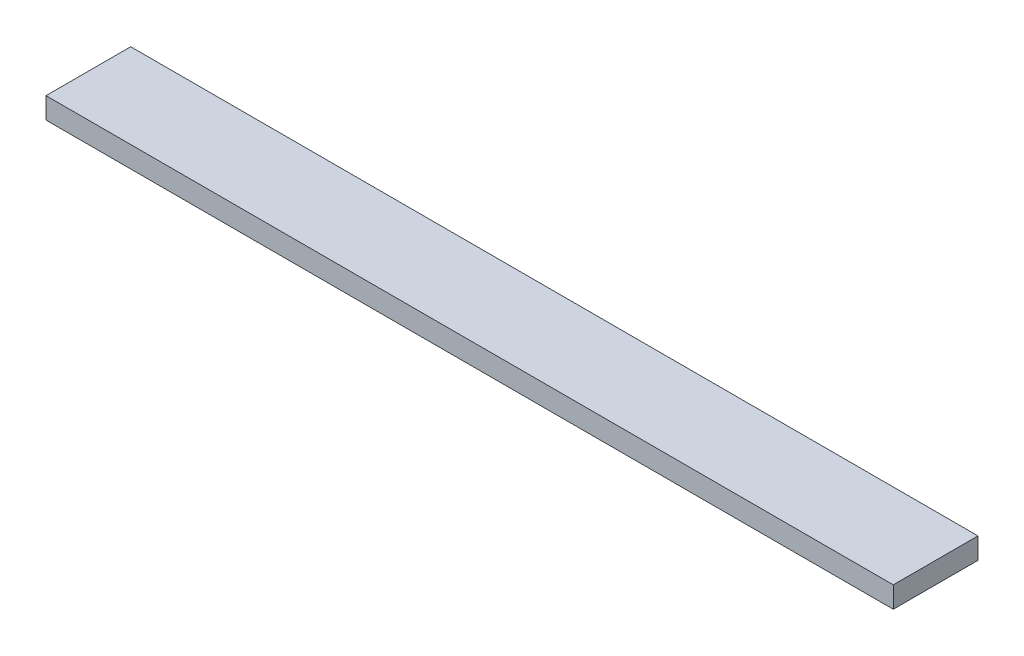
ISO-10303-21;
HEADER;
FILE_DESCRIPTION(('STEP AP214'),'2;1');
FILE_NAME('part.step','',(''),(''),'','','');
FILE_SCHEMA(('AUTOMOTIVE_DESIGN { 1 0 10303 214 1 1 1 1 }'));
ENDSEC;
DATA;
#1=APPLICATION_CONTEXT('core data for automotive mechanical design processes');
#2=APPLICATION_PROTOCOL_DEFINITION('international standard','automotive_design',2000,#1);
#3=PRODUCT_CONTEXT('',#1,'mechanical');
#4=PRODUCT('Part','Part','',(#3));
#5=PRODUCT_RELATED_PRODUCT_CATEGORY('part','',(#4));
#6=PRODUCT_DEFINITION_FORMATION('','',#4);
#7=PRODUCT_DEFINITION_CONTEXT('part definition',#1,'design');
#8=PRODUCT_DEFINITION('design','',#6,#7);
#9=PRODUCT_DEFINITION_SHAPE('','',#8);
#10=(LENGTH_UNIT() NAMED_UNIT(*) SI_UNIT(.MILLI.,.METRE.));
#11=(NAMED_UNIT(*) PLANE_ANGLE_UNIT() SI_UNIT($,.RADIAN.));
#12=(NAMED_UNIT(*) SI_UNIT($,.STERADIAN.) SOLID_ANGLE_UNIT());
#13=UNCERTAINTY_MEASURE_WITH_UNIT(LENGTH_MEASURE(1.E-05),#10,'distance_accuracy_value','');
#14=(GEOMETRIC_REPRESENTATION_CONTEXT(3) GLOBAL_UNCERTAINTY_ASSIGNED_CONTEXT((#13)) GLOBAL_UNIT_ASSIGNED_CONTEXT((#10,
#11,#12)) REPRESENTATION_CONTEXT('',''));
#15=CARTESIAN_POINT('',(0.,0.,0.));
#16=DIRECTION('',(0.,0.,1.));
#17=DIRECTION('',(1.,0.,0.));
#18=AXIS2_PLACEMENT_3D('',#15,#16,#17);
#19=CARTESIAN_POINT('',(-199.999999999999,-199.999999999999,40.));
#20=DIRECTION('',(1.,0.,0.));
#21=DIRECTION('',(0.,1.,0.));
#22=AXIS2_PLACEMENT_3D('',#19,#20,#21);
#23=PLANE('',#22);
#24=DIRECTION('',(0.,-1.,0.));
#25=VECTOR('',#24,1.);
#26=CARTESIAN_POINT('',(-199.999999999999,-199.999999999999,0.));
#27=LINE('',#26,#25);
#28=CARTESIAN_POINT('',(-199.999999999999,-189.999999999999,0.));
#29=VERTEX_POINT('',#28);
#30=CARTESIAN_POINT('',(-199.999999999999,-199.999999999999,0.));
#31=VERTEX_POINT('',#30);
#32=EDGE_CURVE('E99',#29,#31,#27,.T.);
#33=ORIENTED_EDGE('',*,*,#32,.T.);
#34=DIRECTION('',(0.,0.,-1.));
#35=VECTOR('',#34,1.);
#36=CARTESIAN_POINT('',(-199.999999999999,-199.999999999999,40.));
#37=LINE('',#36,#35);
#38=CARTESIAN_POINT('',(-199.999999999999,-199.999999999999,40.));
#39=VERTEX_POINT('',#38);
#40=EDGE_CURVE('E11',#39,#31,#37,.T.);
#41=ORIENTED_EDGE('',*,*,#40,.F.);
#42=DIRECTION('',(0.,-1.,0.));
#43=VECTOR('',#42,1.);
#44=CARTESIAN_POINT('',(-199.999999999999,-199.999999999999,40.));
#45=LINE('',#44,#43);
#46=CARTESIAN_POINT('',(-199.999999999999,-189.999999999999,40.));
#47=VERTEX_POINT('',#46);
#48=EDGE_CURVE('E87',#47,#39,#45,.T.);
#49=ORIENTED_EDGE('',*,*,#48,.F.);
#50=DIRECTION('',(0.,0.,-1.));
#51=VECTOR('',#50,1.);
#52=CARTESIAN_POINT('',(-199.999999999999,-189.999999999999,40.));
#53=LINE('',#52,#51);
#54=EDGE_CURVE('E95',#47,#29,#53,.T.);
#55=ORIENTED_EDGE('',*,*,#54,.T.);
#56=EDGE_LOOP('',(#33,#41,#49,#55));
#57=FACE_BOUND('',#56,.T.);
#58=ADVANCED_FACE('F36',(#57),#23,.F.);
#59=CARTESIAN_POINT('',(-199.999999999999,-199.999999999999,40.));
#60=DIRECTION('',(0.,1.,0.));
#61=DIRECTION('',(0.,0.,1.));
#62=AXIS2_PLACEMENT_3D('',#59,#60,#61);
#63=PLANE('',#62);
#64=DIRECTION('',(1.,0.,0.));
#65=VECTOR('',#64,1.);
#66=CARTESIAN_POINT('',(-199.999999999999,-199.999999999999,0.));
#67=LINE('',#66,#65);
#68=CARTESIAN_POINT('',(199.999999999999,-199.999999999999,0.));
#69=VERTEX_POINT('',#68);
#70=EDGE_CURVE('E91',#31,#69,#67,.T.);
#71=ORIENTED_EDGE('',*,*,#70,.T.);
#72=DIRECTION('',(0.,0.,-1.));
#73=VECTOR('',#72,1.);
#74=CARTESIAN_POINT('',(199.999999999999,-199.999999999999,40.));
#75=LINE('',#74,#73);
#76=CARTESIAN_POINT('',(199.999999999999,-199.999999999999,40.));
#77=VERTEX_POINT('',#76);
#78=EDGE_CURVE('E44',#77,#69,#75,.T.);
#79=ORIENTED_EDGE('',*,*,#78,.F.);
#80=DIRECTION('',(1.,0.,0.));
#81=VECTOR('',#80,1.);
#82=CARTESIAN_POINT('',(-199.999999999999,-199.999999999999,40.));
#83=LINE('',#82,#81);
#84=EDGE_CURVE('E82',#39,#77,#83,.T.);
#85=ORIENTED_EDGE('',*,*,#84,.F.);
#86=ORIENTED_EDGE('',*,*,#40,.T.);
#87=EDGE_LOOP('',(#71,#79,#85,#86));
#88=FACE_BOUND('',#87,.T.);
#89=ADVANCED_FACE('F90',(#88),#63,.F.);
#90=CARTESIAN_POINT('',(199.999999999999,-199.999999999999,40.));
#91=DIRECTION('',(-1.,0.,0.));
#92=DIRECTION('',(0.,-1.,0.));
#93=AXIS2_PLACEMENT_3D('',#90,#91,#92);
#94=PLANE('',#93);
#95=DIRECTION('',(0.,1.,0.));
#96=VECTOR('',#95,1.);
#97=CARTESIAN_POINT('',(199.999999999999,-199.999999999999,0.));
#98=LINE('',#97,#96);
#99=CARTESIAN_POINT('',(199.999999999999,-189.999999999999,0.));
#100=VERTEX_POINT('',#99);
#101=EDGE_CURVE('E69',#69,#100,#98,.T.);
#102=ORIENTED_EDGE('',*,*,#101,.T.);
#103=DIRECTION('',(0.,0.,-1.));
#104=VECTOR('',#103,1.);
#105=CARTESIAN_POINT('',(199.999999999999,-189.999999999999,40.));
#106=LINE('',#105,#104);
#107=CARTESIAN_POINT('',(199.999999999999,-189.999999999999,40.));
#108=VERTEX_POINT('',#107);
#109=EDGE_CURVE('E92',#108,#100,#106,.T.);
#110=ORIENTED_EDGE('',*,*,#109,.F.);
#111=DIRECTION('',(0.,1.,0.));
#112=VECTOR('',#111,1.);
#113=CARTESIAN_POINT('',(199.999999999999,-199.999999999999,40.));
#114=LINE('',#113,#112);
#115=EDGE_CURVE('E85',#77,#108,#114,.T.);
#116=ORIENTED_EDGE('',*,*,#115,.F.);
#117=ORIENTED_EDGE('',*,*,#78,.T.);
#118=EDGE_LOOP('',(#102,#110,#116,#117));
#119=FACE_BOUND('',#118,.T.);
#120=ADVANCED_FACE('F93',(#119),#94,.F.);
#121=CARTESIAN_POINT('',(-199.999999999999,-189.999999999999,40.));
#122=DIRECTION('',(0.,-1.,0.));
#123=DIRECTION('',(1.,0.,0.));
#124=AXIS2_PLACEMENT_3D('',#121,#122,#123);
#125=PLANE('',#124);
#126=DIRECTION('',(-1.,0.,0.));
#127=VECTOR('',#126,1.);
#128=CARTESIAN_POINT('',(-199.999999999999,-189.999999999999,0.));
#129=LINE('',#128,#127);
#130=EDGE_CURVE('E75',#100,#29,#129,.T.);
#131=ORIENTED_EDGE('',*,*,#130,.T.);
#132=ORIENTED_EDGE('',*,*,#54,.F.);
#133=DIRECTION('',(-1.,0.,0.));
#134=VECTOR('',#133,1.);
#135=CARTESIAN_POINT('',(-199.999999999999,-189.999999999999,40.));
#136=LINE('',#135,#134);
#137=EDGE_CURVE('E52',#108,#47,#136,.T.);
#138=ORIENTED_EDGE('',*,*,#137,.F.);
#139=ORIENTED_EDGE('',*,*,#109,.T.);
#140=EDGE_LOOP('',(#131,#132,#138,#139));
#141=FACE_BOUND('',#140,.T.);
#142=ADVANCED_FACE('F106',(#141),#125,.F.);
#143=CARTESIAN_POINT('',(0.,0.,40.));
#144=DIRECTION('',(0.,0.,-1.));
#145=DIRECTION('',(-1.,0.,0.));
#146=AXIS2_PLACEMENT_3D('',#143,#144,#145);
#147=PLANE('',#146);
#148=ORIENTED_EDGE('',*,*,#48,.T.);
#149=ORIENTED_EDGE('',*,*,#84,.T.);
#150=ORIENTED_EDGE('',*,*,#115,.T.);
#151=ORIENTED_EDGE('',*,*,#137,.T.);
#152=EDGE_LOOP('',(#148,#149,#150,#151));
#153=FACE_BOUND('',#152,.T.);
#154=ADVANCED_FACE('F83',(#153),#147,.F.);
#155=CARTESIAN_POINT('',(0.,0.,0.));
#156=DIRECTION('',(0.,0.,-1.));
#157=DIRECTION('',(-1.,0.,0.));
#158=AXIS2_PLACEMENT_3D('',#155,#156,#157);
#159=PLANE('',#158);
#160=ORIENTED_EDGE('',*,*,#32,.F.);
#161=ORIENTED_EDGE('',*,*,#130,.F.);
#162=ORIENTED_EDGE('',*,*,#101,.F.);
#163=ORIENTED_EDGE('',*,*,#70,.F.);
#164=EDGE_LOOP('',(#160,#161,#162,#163));
#165=FACE_BOUND('',#164,.T.);
#166=ADVANCED_FACE('F109',(#165),#159,.T.);
#167=CLOSED_SHELL('',(#58,#89,#120,#142,#154,#166));
#168=MANIFOLD_SOLID_BREP('B2',#167);
#169=ADVANCED_BREP_SHAPE_REPRESENTATION('',(#18,#168),#14);
#170=SHAPE_DEFINITION_REPRESENTATION(#9,#169);
ENDSEC;
END-ISO-10303-21;
